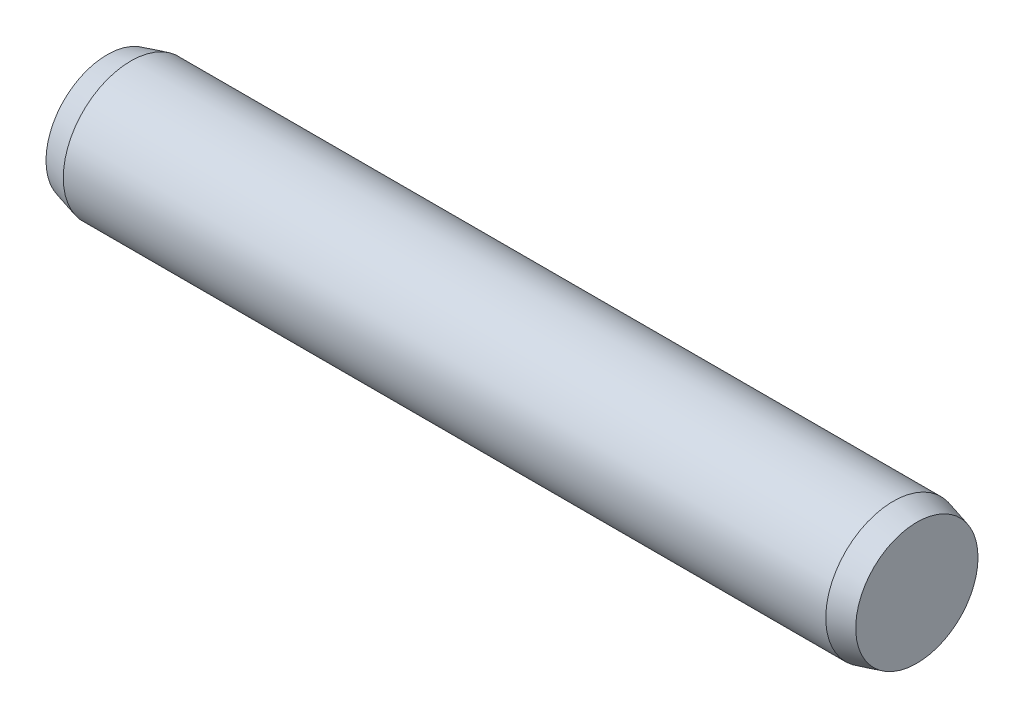
ISO-10303-21;
HEADER;
FILE_DESCRIPTION(('STEP AP214'),'2;1');
FILE_NAME('part.step','',(''),(''),'','','');
FILE_SCHEMA(('AUTOMOTIVE_DESIGN { 1 0 10303 214 1 1 1 1 }'));
ENDSEC;
DATA;
#1=APPLICATION_CONTEXT('core data for automotive mechanical design processes');
#2=APPLICATION_PROTOCOL_DEFINITION('international standard','automotive_design',2000,#1);
#3=PRODUCT_CONTEXT('',#1,'mechanical');
#4=PRODUCT('Part','Part','',(#3));
#5=PRODUCT_RELATED_PRODUCT_CATEGORY('part','',(#4));
#6=PRODUCT_DEFINITION_FORMATION('','',#4);
#7=PRODUCT_DEFINITION_CONTEXT('part definition',#1,'design');
#8=PRODUCT_DEFINITION('design','',#6,#7);
#9=PRODUCT_DEFINITION_SHAPE('','',#8);
#10=(LENGTH_UNIT() NAMED_UNIT(*) SI_UNIT(.MILLI.,.METRE.));
#11=(NAMED_UNIT(*) PLANE_ANGLE_UNIT() SI_UNIT($,.RADIAN.));
#12=(NAMED_UNIT(*) SI_UNIT($,.STERADIAN.) SOLID_ANGLE_UNIT());
#13=UNCERTAINTY_MEASURE_WITH_UNIT(LENGTH_MEASURE(1.E-05),#10,'distance_accuracy_value','');
#14=(GEOMETRIC_REPRESENTATION_CONTEXT(3) GLOBAL_UNCERTAINTY_ASSIGNED_CONTEXT((#13)) GLOBAL_UNIT_ASSIGNED_CONTEXT((#10,
#11,#12)) REPRESENTATION_CONTEXT('',''));
#15=CARTESIAN_POINT('',(0.,0.,0.));
#16=DIRECTION('',(0.,0.,1.));
#17=DIRECTION('',(1.,0.,0.));
#18=AXIS2_PLACEMENT_3D('',#15,#16,#17);
#19=CARTESIAN_POINT('',(-5.65000000000001,0.,0.));
#20=DIRECTION('',(1.,0.,0.));
#21=DIRECTION('',(0.,0.,-1.));
#22=AXIS2_PLACEMENT_3D('',#19,#20,#21);
#23=CYLINDRICAL_SURFACE('',#22,1.);
#24=CARTESIAN_POINT('',(-5.65000000000001,0.,0.));
#25=DIRECTION('',(-1.,0.,0.));
#26=DIRECTION('',(0.,0.,1.));
#27=AXIS2_PLACEMENT_3D('',#24,#25,#26);
#28=CIRCLE('',#27,1.);
#29=CARTESIAN_POINT('',(-5.65000000000001,0.,1.));
#30=VERTEX_POINT('',#29);
#31=EDGE_CURVE('E58',#30,#30,#28,.T.);
#32=ORIENTED_EDGE('',*,*,#31,.F.);
#33=EDGE_LOOP('',(#32));
#34=FACE_BOUND('',#33,.T.);
#35=CARTESIAN_POINT('',(5.65000000000001,0.,0.));
#36=DIRECTION('',(1.,0.,0.));
#37=DIRECTION('',(0.,0.,-1.));
#38=AXIS2_PLACEMENT_3D('',#35,#36,#37);
#39=CIRCLE('',#38,1.);
#40=CARTESIAN_POINT('',(5.65000000000001,0.,-1.));
#41=VERTEX_POINT('',#40);
#42=EDGE_CURVE('E10',#41,#41,#39,.T.);
#43=ORIENTED_EDGE('',*,*,#42,.F.);
#44=EDGE_LOOP('',(#43));
#45=FACE_BOUND('',#44,.T.);
#46=ADVANCED_FACE('F39',(#34,#45),#23,.T.);
#47=CARTESIAN_POINT('',(5.65000000000001,0.,0.));
#48=DIRECTION('',(-1.,0.,0.));
#49=DIRECTION('',(0.,0.,-1.));
#50=AXIS2_PLACEMENT_3D('',#47,#48,#49);
#51=CONICAL_SURFACE('',#50,1.,0.26179938779915);
#52=CARTESIAN_POINT('',(6.,0.,0.));
#53=DIRECTION('',(1.,0.,0.));
#54=DIRECTION('',(0.,0.,-1.));
#55=AXIS2_PLACEMENT_3D('',#52,#53,#54);
#56=CIRCLE('',#55,0.90621778264911);
#57=CARTESIAN_POINT('',(6.,0.,-0.90621778264911));
#58=VERTEX_POINT('',#57);
#59=EDGE_CURVE('E46',#58,#58,#56,.T.);
#60=ORIENTED_EDGE('',*,*,#59,.F.);
#61=EDGE_LOOP('',(#60));
#62=FACE_BOUND('',#61,.T.);
#63=ORIENTED_EDGE('',*,*,#42,.T.);
#64=EDGE_LOOP('',(#63));
#65=FACE_BOUND('',#64,.T.);
#66=ADVANCED_FACE('F70',(#62,#65),#51,.T.);
#67=CARTESIAN_POINT('',(6.,0.,0.));
#68=DIRECTION('',(1.,0.,0.));
#69=DIRECTION('',(0.,0.,-1.));
#70=AXIS2_PLACEMENT_3D('',#67,#68,#69);
#71=PLANE('',#70);
#72=ORIENTED_EDGE('',*,*,#59,.T.);
#73=EDGE_LOOP('',(#72));
#74=FACE_BOUND('',#73,.T.);
#75=ADVANCED_FACE('F74',(#74),#71,.T.);
#76=CARTESIAN_POINT('',(-5.65000000000001,0.,0.));
#77=DIRECTION('',(1.,0.,0.));
#78=DIRECTION('',(0.,0.,1.));
#79=AXIS2_PLACEMENT_3D('',#76,#77,#78);
#80=CONICAL_SURFACE('',#79,1.,0.26179938779915);
#81=CARTESIAN_POINT('',(-6.00000000000001,0.,0.));
#82=DIRECTION('',(-1.,0.,0.));
#83=DIRECTION('',(0.,0.,1.));
#84=AXIS2_PLACEMENT_3D('',#81,#82,#83);
#85=CIRCLE('',#84,0.906217782649108);
#86=CARTESIAN_POINT('',(-6.00000000000001,0.,0.906217782649108));
#87=VERTEX_POINT('',#86);
#88=EDGE_CURVE('E52',#87,#87,#85,.T.);
#89=ORIENTED_EDGE('',*,*,#88,.F.);
#90=EDGE_LOOP('',(#89));
#91=FACE_BOUND('',#90,.T.);
#92=ORIENTED_EDGE('',*,*,#31,.T.);
#93=EDGE_LOOP('',(#92));
#94=FACE_BOUND('',#93,.T.);
#95=ADVANCED_FACE('F66',(#91,#94),#80,.T.);
#96=CARTESIAN_POINT('',(-6.00000000000001,0.,0.));
#97=DIRECTION('',(-1.,0.,0.));
#98=DIRECTION('',(0.,0.,1.));
#99=AXIS2_PLACEMENT_3D('',#96,#97,#98);
#100=PLANE('',#99);
#101=ORIENTED_EDGE('',*,*,#88,.T.);
#102=EDGE_LOOP('',(#101));
#103=FACE_BOUND('',#102,.T.);
#104=ADVANCED_FACE('F83',(#103),#100,.T.);
#105=CLOSED_SHELL('',(#46,#66,#75,#95,#104));
#106=MANIFOLD_SOLID_BREP('B2',#105);
#107=ADVANCED_BREP_SHAPE_REPRESENTATION('',(#18,#106),#14);
#108=SHAPE_DEFINITION_REPRESENTATION(#9,#107);
ENDSEC;
END-ISO-10303-21;
